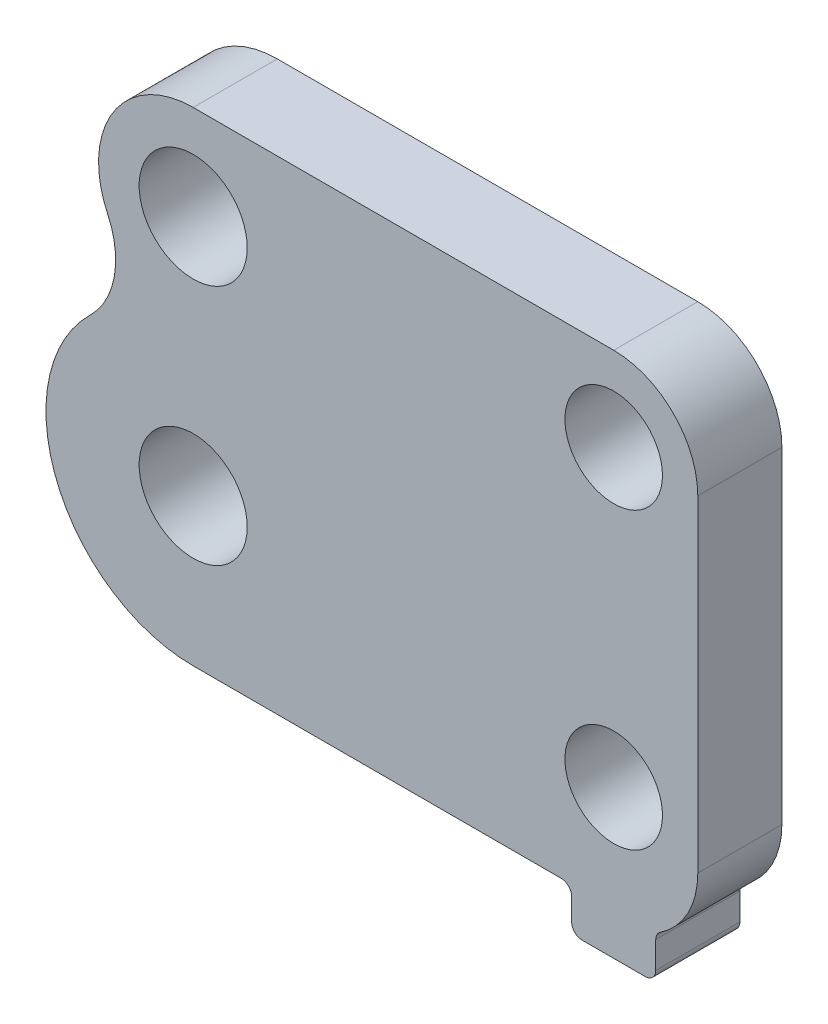
ISO-10303-21;
HEADER;
FILE_DESCRIPTION(('STEP AP214'),'2;1');
FILE_NAME('part.step','',(''),(''),'','','');
FILE_SCHEMA(('AUTOMOTIVE_DESIGN { 1 0 10303 214 1 1 1 1 }'));
ENDSEC;
DATA;
#1=APPLICATION_CONTEXT('core data for automotive mechanical design processes');
#2=APPLICATION_PROTOCOL_DEFINITION('international standard','automotive_design',2000,#1);
#3=PRODUCT_CONTEXT('',#1,'mechanical');
#4=PRODUCT('Part','Part','',(#3));
#5=PRODUCT_RELATED_PRODUCT_CATEGORY('part','',(#4));
#6=PRODUCT_DEFINITION_FORMATION('','',#4);
#7=PRODUCT_DEFINITION_CONTEXT('part definition',#1,'design');
#8=PRODUCT_DEFINITION('design','',#6,#7);
#9=PRODUCT_DEFINITION_SHAPE('','',#8);
#10=(LENGTH_UNIT() NAMED_UNIT(*) SI_UNIT(.MILLI.,.METRE.));
#11=(NAMED_UNIT(*) PLANE_ANGLE_UNIT() SI_UNIT($,.RADIAN.));
#12=(NAMED_UNIT(*) SI_UNIT($,.STERADIAN.) SOLID_ANGLE_UNIT());
#13=UNCERTAINTY_MEASURE_WITH_UNIT(LENGTH_MEASURE(1.E-05),#10,'distance_accuracy_value','');
#14=(GEOMETRIC_REPRESENTATION_CONTEXT(3) GLOBAL_UNCERTAINTY_ASSIGNED_CONTEXT((#13)) GLOBAL_UNIT_ASSIGNED_CONTEXT((#10,
#11,#12)) REPRESENTATION_CONTEXT('',''));
#15=CARTESIAN_POINT('',(0.,0.,0.));
#16=DIRECTION('',(0.,0.,1.));
#17=DIRECTION('',(1.,0.,0.));
#18=AXIS2_PLACEMENT_3D('',#15,#16,#17);
#19=CARTESIAN_POINT('',(0.,12.7,3.175));
#20=DIRECTION('',(0.,1.,0.));
#21=DIRECTION('',(0.,0.,1.));
#22=AXIS2_PLACEMENT_3D('',#19,#20,#21);
#23=PLANE('',#22);
#24=DIRECTION('',(1.,0.,0.));
#25=VECTOR('',#24,1.);
#26=CARTESIAN_POINT('',(0.,12.7,3.175));
#27=LINE('',#26,#25);
#28=CARTESIAN_POINT('',(0.,12.7,3.175));
#29=VERTEX_POINT('',#28);
#30=CARTESIAN_POINT('',(15.875,12.7,3.175));
#31=VERTEX_POINT('',#30);
#32=EDGE_CURVE('E150',#29,#31,#27,.T.);
#33=ORIENTED_EDGE('',*,*,#32,.T.);
#34=DIRECTION('',(0.,0.,-1.));
#35=VECTOR('',#34,1.);
#36=CARTESIAN_POINT('',(15.875,12.7,0.));
#37=LINE('',#36,#35);
#38=CARTESIAN_POINT('',(15.875,12.7,0.));
#39=VERTEX_POINT('',#38);
#40=EDGE_CURVE('E157',#31,#39,#37,.T.);
#41=ORIENTED_EDGE('',*,*,#40,.T.);
#42=DIRECTION('',(1.,0.,0.));
#43=VECTOR('',#42,1.);
#44=CARTESIAN_POINT('',(0.,12.7,0.));
#45=LINE('',#44,#43);
#46=CARTESIAN_POINT('',(0.,12.7,0.));
#47=VERTEX_POINT('',#46);
#48=EDGE_CURVE('E153',#47,#39,#45,.T.);
#49=ORIENTED_EDGE('',*,*,#48,.F.);
#50=DIRECTION('',(0.,0.,-1.));
#51=VECTOR('',#50,1.);
#52=CARTESIAN_POINT('',(0.,12.7,3.175));
#53=LINE('',#52,#51);
#54=EDGE_CURVE('E146',#29,#47,#53,.T.);
#55=ORIENTED_EDGE('',*,*,#54,.F.);
#56=EDGE_LOOP('',(#33,#41,#49,#55));
#57=FACE_BOUND('',#56,.T.);
#58=ADVANCED_FACE('F39',(#57),#23,.T.);
#59=CARTESIAN_POINT('',(0.,9.128125,3.175));
#60=DIRECTION('',(0.,0.,-1.));
#61=DIRECTION('',(-1.,0.,0.));
#62=AXIS2_PLACEMENT_3D('',#59,#60,#61);
#63=CYLINDRICAL_SURFACE('',#62,3.571875);
#64=CARTESIAN_POINT('',(0.,9.128125,0.));
#65=DIRECTION('',(0.,0.,1.));
#66=DIRECTION('',(1.,0.,0.));
#67=AXIS2_PLACEMENT_3D('',#64,#65,#66);
#68=CIRCLE('',#67,3.571875);
#69=CARTESIAN_POINT('',(-3.22968824866037,7.6025415601023,0.));
#70=VERTEX_POINT('',#69);
#71=EDGE_CURVE('E207',#47,#70,#68,.T.);
#72=ORIENTED_EDGE('',*,*,#71,.T.);
#73=DIRECTION('',(0.,0.,-1.));
#74=VECTOR('',#73,1.);
#75=CARTESIAN_POINT('',(-3.22968824866037,7.6025415601023,3.175));
#76=LINE('',#75,#74);
#77=CARTESIAN_POINT('',(-3.22968824866037,7.6025415601023,3.175));
#78=VERTEX_POINT('',#77);
#79=EDGE_CURVE('E158',#78,#70,#76,.T.);
#80=ORIENTED_EDGE('',*,*,#79,.F.);
#81=CARTESIAN_POINT('',(0.,9.128125,3.175));
#82=DIRECTION('',(0.,0.,1.));
#83=DIRECTION('',(1.,0.,0.));
#84=AXIS2_PLACEMENT_3D('',#81,#82,#83);
#85=CIRCLE('',#84,3.571875);
#86=EDGE_CURVE('E161',#29,#78,#85,.T.);
#87=ORIENTED_EDGE('',*,*,#86,.F.);
#88=ORIENTED_EDGE('',*,*,#54,.T.);
#89=EDGE_LOOP('',(#72,#80,#87,#88));
#90=FACE_BOUND('',#89,.T.);
#91=ADVANCED_FACE('F162',(#90),#63,.T.);
#92=CARTESIAN_POINT('',(-6.10052224746959,6.24646739130435,3.175));
#93=DIRECTION('',(0.,0.,-1.));
#94=DIRECTION('',(-1.,0.,0.));
#95=AXIS2_PLACEMENT_3D('',#92,#93,#94);
#96=CYLINDRICAL_SURFACE('',#95,3.175);
#97=CARTESIAN_POINT('',(-6.10052224746959,6.24646739130435,0.));
#98=DIRECTION('',(0.,0.,1.));
#99=DIRECTION('',(1.,0.,0.));
#100=AXIS2_PLACEMENT_3D('',#97,#98,#99);
#101=CIRCLE('',#100,3.175);
#102=CARTESIAN_POINT('',(-3.88215052111701,3.97502470355731,0.));
#103=VERTEX_POINT('',#102);
#104=EDGE_CURVE('E209',#103,#70,#101,.T.);
#105=ORIENTED_EDGE('',*,*,#104,.F.);
#106=DIRECTION('',(0.,0.,-1.));
#107=VECTOR('',#106,1.);
#108=CARTESIAN_POINT('',(-3.88215052111701,3.97502470355731,3.175));
#109=LINE('',#108,#107);
#110=CARTESIAN_POINT('',(-3.88215052111701,3.97502470355731,3.175));
#111=VERTEX_POINT('',#110);
#112=EDGE_CURVE('E238',#111,#103,#109,.T.);
#113=ORIENTED_EDGE('',*,*,#112,.F.);
#114=CARTESIAN_POINT('',(-6.10052224746959,6.24646739130435,3.175));
#115=DIRECTION('',(0.,0.,1.));
#116=DIRECTION('',(1.,0.,0.));
#117=AXIS2_PLACEMENT_3D('',#114,#115,#116);
#118=CIRCLE('',#117,3.175);
#119=EDGE_CURVE('E165',#111,#78,#118,.T.);
#120=ORIENTED_EDGE('',*,*,#119,.T.);
#121=ORIENTED_EDGE('',*,*,#79,.T.);
#122=EDGE_LOOP('',(#105,#113,#120,#121));
#123=FACE_BOUND('',#122,.T.);
#124=ADVANCED_FACE('F334',(#123),#96,.F.);
#125=CARTESIAN_POINT('',(0.,0.,3.175));
#126=DIRECTION('',(0.,0.,-1.));
#127=DIRECTION('',(-1.,0.,0.));
#128=AXIS2_PLACEMENT_3D('',#125,#126,#127);
#129=CYLINDRICAL_SURFACE('',#128,5.55625);
#130=CARTESIAN_POINT('',(0.,0.,0.));
#131=DIRECTION('',(0.,0.,1.));
#132=DIRECTION('',(1.,0.,0.));
#133=AXIS2_PLACEMENT_3D('',#130,#131,#132);
#134=CIRCLE('',#133,5.55625);
#135=CARTESIAN_POINT('',(0.,-5.55625,0.));
#136=VERTEX_POINT('',#135);
#137=EDGE_CURVE('E212',#103,#136,#134,.T.);
#138=ORIENTED_EDGE('',*,*,#137,.T.);
#139=DIRECTION('',(0.,0.,-1.));
#140=VECTOR('',#139,1.);
#141=CARTESIAN_POINT('',(0.,-5.55625,3.175));
#142=LINE('',#141,#140);
#143=CARTESIAN_POINT('',(0.,-5.55625,3.175));
#144=VERTEX_POINT('',#143);
#145=EDGE_CURVE('E205',#144,#136,#142,.T.);
#146=ORIENTED_EDGE('',*,*,#145,.F.);
#147=CARTESIAN_POINT('',(0.,0.,3.175));
#148=DIRECTION('',(0.,0.,1.));
#149=DIRECTION('',(1.,0.,0.));
#150=AXIS2_PLACEMENT_3D('',#147,#148,#149);
#151=CIRCLE('',#150,5.55625);
#152=EDGE_CURVE('E180',#111,#144,#151,.T.);
#153=ORIENTED_EDGE('',*,*,#152,.F.);
#154=ORIENTED_EDGE('',*,*,#112,.T.);
#155=EDGE_LOOP('',(#138,#146,#153,#154));
#156=FACE_BOUND('',#155,.T.);
#157=ADVANCED_FACE('F337',(#156),#129,.T.);
#158=CARTESIAN_POINT('',(0.,-5.55625,3.175));
#159=DIRECTION('',(0.,1.,0.));
#160=DIRECTION('',(-1.,0.,0.));
#161=AXIS2_PLACEMENT_3D('',#158,#159,#160);
#162=PLANE('',#161);
#163=DIRECTION('',(1.,0.,0.));
#164=VECTOR('',#163,1.);
#165=CARTESIAN_POINT('',(0.,-5.55625,0.));
#166=LINE('',#165,#164);
#167=CARTESIAN_POINT('',(13.890625,-5.55625,0.));
#168=VERTEX_POINT('',#167);
#169=EDGE_CURVE('E214',#136,#168,#166,.T.);
#170=ORIENTED_EDGE('',*,*,#169,.T.);
#171=DIRECTION('',(0.,0.,-1.));
#172=VECTOR('',#171,1.);
#173=CARTESIAN_POINT('',(13.890625,-5.55625,3.175));
#174=LINE('',#173,#172);
#175=CARTESIAN_POINT('',(13.890625,-5.55625,3.175));
#176=VERTEX_POINT('',#175);
#177=EDGE_CURVE('E280',#168,#176,#174,.F.);
#178=ORIENTED_EDGE('',*,*,#177,.T.);
#179=DIRECTION('',(1.,0.,0.));
#180=VECTOR('',#179,1.);
#181=CARTESIAN_POINT('',(0.,-5.55625,3.175));
#182=LINE('',#181,#180);
#183=EDGE_CURVE('E182',#144,#176,#182,.T.);
#184=ORIENTED_EDGE('',*,*,#183,.F.);
#185=ORIENTED_EDGE('',*,*,#145,.T.);
#186=EDGE_LOOP('',(#170,#178,#184,#185));
#187=FACE_BOUND('',#186,.T.);
#188=ADVANCED_FACE('F296',(#187),#162,.F.);
#189=CARTESIAN_POINT('',(14.2875,0.,3.175));
#190=DIRECTION('',(1.,0.,0.));
#191=DIRECTION('',(0.,1.,0.));
#192=AXIS2_PLACEMENT_3D('',#189,#190,#191);
#193=PLANE('',#192);
#194=DIRECTION('',(0.,-1.,0.));
#195=VECTOR('',#194,1.);
#196=CARTESIAN_POINT('',(14.2875,0.,0.));
#197=LINE('',#196,#195);
#198=CARTESIAN_POINT('',(14.2875,-5.953125,0.));
#199=VERTEX_POINT('',#198);
#200=CARTESIAN_POINT('',(14.2875,-6.784975,0.));
#201=VERTEX_POINT('',#200);
#202=EDGE_CURVE('E217',#199,#201,#197,.T.);
#203=ORIENTED_EDGE('',*,*,#202,.T.);
#204=DIRECTION('',(0.,0.,-1.));
#205=VECTOR('',#204,1.);
#206=CARTESIAN_POINT('',(14.2875,-6.784975,3.175));
#207=LINE('',#206,#205);
#208=CARTESIAN_POINT('',(14.2875,-6.784975,3.175));
#209=VERTEX_POINT('',#208);
#210=EDGE_CURVE('E54',#201,#209,#207,.F.);
#211=ORIENTED_EDGE('',*,*,#210,.T.);
#212=DIRECTION('',(0.,-1.,0.));
#213=VECTOR('',#212,1.);
#214=CARTESIAN_POINT('',(14.2875,0.,3.175));
#215=LINE('',#214,#213);
#216=CARTESIAN_POINT('',(14.2875,-5.953125,3.175));
#217=VERTEX_POINT('',#216);
#218=EDGE_CURVE('E184',#217,#209,#215,.T.);
#219=ORIENTED_EDGE('',*,*,#218,.F.);
#220=DIRECTION('',(0.,0.,-1.));
#221=VECTOR('',#220,1.);
#222=CARTESIAN_POINT('',(14.2875,-5.953125,0.));
#223=LINE('',#222,#221);
#224=EDGE_CURVE('E276',#217,#199,#223,.T.);
#225=ORIENTED_EDGE('',*,*,#224,.T.);
#226=EDGE_LOOP('',(#203,#211,#219,#225));
#227=FACE_BOUND('',#226,.T.);
#228=ADVANCED_FACE('F299',(#227),#193,.F.);
#229=CARTESIAN_POINT('',(0.,-7.18185,3.175));
#230=DIRECTION('',(0.,1.,0.));
#231=DIRECTION('',(-1.,0.,0.));
#232=AXIS2_PLACEMENT_3D('',#229,#230,#231);
#233=PLANE('',#232);
#234=DIRECTION('',(1.,0.,0.));
#235=VECTOR('',#234,1.);
#236=CARTESIAN_POINT('',(0.,-7.18185,0.));
#237=LINE('',#236,#235);
#238=CARTESIAN_POINT('',(14.684375,-7.18185,0.));
#239=VERTEX_POINT('',#238);
#240=CARTESIAN_POINT('',(17.065625,-7.18185,0.));
#241=VERTEX_POINT('',#240);
#242=EDGE_CURVE('E219',#239,#241,#237,.T.);
#243=ORIENTED_EDGE('',*,*,#242,.T.);
#244=DIRECTION('',(0.,0.,-1.));
#245=VECTOR('',#244,1.);
#246=CARTESIAN_POINT('',(17.065625,-7.18185,3.175));
#247=LINE('',#246,#245);
#248=CARTESIAN_POINT('',(17.065625,-7.18185,3.175));
#249=VERTEX_POINT('',#248);
#250=EDGE_CURVE('E270',#241,#249,#247,.F.);
#251=ORIENTED_EDGE('',*,*,#250,.T.);
#252=DIRECTION('',(1.,0.,0.));
#253=VECTOR('',#252,1.);
#254=CARTESIAN_POINT('',(0.,-7.18185,3.175));
#255=LINE('',#254,#253);
#256=CARTESIAN_POINT('',(14.684375,-7.18185,3.175));
#257=VERTEX_POINT('',#256);
#258=EDGE_CURVE('E186',#257,#249,#255,.T.);
#259=ORIENTED_EDGE('',*,*,#258,.F.);
#260=DIRECTION('',(0.,0.,-1.));
#261=VECTOR('',#260,1.);
#262=CARTESIAN_POINT('',(14.684375,-7.18185,3.175));
#263=LINE('',#262,#261);
#264=EDGE_CURVE('E267',#257,#239,#263,.T.);
#265=ORIENTED_EDGE('',*,*,#264,.T.);
#266=EDGE_LOOP('',(#243,#251,#259,#265));
#267=FACE_BOUND('',#266,.T.);
#268=ADVANCED_FACE('F307',(#267),#233,.F.);
#269=CARTESIAN_POINT('',(17.4625,0.,3.175));
#270=DIRECTION('',(-1.,0.,0.));
#271=DIRECTION('',(0.,0.,1.));
#272=AXIS2_PLACEMENT_3D('',#269,#270,#271);
#273=PLANE('',#272);
#274=DIRECTION('',(0.,1.,0.));
#275=VECTOR('',#274,1.);
#276=CARTESIAN_POINT('',(17.4625,0.,0.));
#277=LINE('',#276,#275);
#278=CARTESIAN_POINT('',(17.4625,-6.784975,0.));
#279=VERTEX_POINT('',#278);
#280=CARTESIAN_POINT('',(17.4625,-5.77655989373622,0.));
#281=VERTEX_POINT('',#280);
#282=EDGE_CURVE('E222',#279,#281,#277,.T.);
#283=ORIENTED_EDGE('',*,*,#282,.T.);
#284=DIRECTION('',(0.,0.,1.));
#285=VECTOR('',#284,1.);
#286=CARTESIAN_POINT('',(17.4625,-5.77655989373622,3.175));
#287=LINE('',#286,#285);
#288=CARTESIAN_POINT('',(17.4625,-5.77655989373622,3.175));
#289=VERTEX_POINT('',#288);
#290=EDGE_CURVE('E261',#281,#289,#287,.T.);
#291=ORIENTED_EDGE('',*,*,#290,.T.);
#292=DIRECTION('',(0.,1.,0.));
#293=VECTOR('',#292,1.);
#294=CARTESIAN_POINT('',(17.4625,0.,3.175));
#295=LINE('',#294,#293);
#296=CARTESIAN_POINT('',(17.4625,-6.784975,3.175));
#297=VERTEX_POINT('',#296);
#298=EDGE_CURVE('E188',#297,#289,#295,.T.);
#299=ORIENTED_EDGE('',*,*,#298,.F.);
#300=DIRECTION('',(0.,0.,-1.));
#301=VECTOR('',#300,1.);
#302=CARTESIAN_POINT('',(17.4625,-6.784975,3.175));
#303=LINE('',#302,#301);
#304=EDGE_CURVE('E258',#297,#279,#303,.T.);
#305=ORIENTED_EDGE('',*,*,#304,.T.);
#306=EDGE_LOOP('',(#283,#291,#299,#305));
#307=FACE_BOUND('',#306,.T.);
#308=ADVANCED_FACE('F315',(#307),#273,.F.);
#309=CARTESIAN_POINT('',(0.,0.,3.175));
#310=DIRECTION('',(0.,0.,-1.));
#311=DIRECTION('',(-1.,0.,0.));
#312=AXIS2_PLACEMENT_3D('',#309,#310,#311);
#313=CYLINDRICAL_SURFACE('',#312,2.0399375);
#314=CARTESIAN_POINT('',(0.,0.,3.175));
#315=DIRECTION('',(0.,0.,1.));
#316=DIRECTION('',(1.,0.,0.));
#317=AXIS2_PLACEMENT_3D('',#314,#315,#316);
#318=CIRCLE('',#317,2.0399375);
#319=CARTESIAN_POINT('',(2.0399375,0.,3.175));
#320=VERTEX_POINT('',#319);
#321=EDGE_CURVE('E199',#320,#320,#318,.T.);
#322=ORIENTED_EDGE('',*,*,#321,.T.);
#323=EDGE_LOOP('',(#322));
#324=FACE_BOUND('',#323,.T.);
#325=CARTESIAN_POINT('',(0.,0.,0.));
#326=DIRECTION('',(0.,0.,1.));
#327=DIRECTION('',(1.,0.,0.));
#328=AXIS2_PLACEMENT_3D('',#325,#326,#327);
#329=CIRCLE('',#328,2.0399375);
#330=CARTESIAN_POINT('',(2.0399375,0.,0.));
#331=VERTEX_POINT('',#330);
#332=EDGE_CURVE('E176',#331,#331,#329,.T.);
#333=ORIENTED_EDGE('',*,*,#332,.F.);
#334=EDGE_LOOP('',(#333));
#335=FACE_BOUND('',#334,.T.);
#336=ADVANCED_FACE('F420',(#324,#335),#313,.F.);
#337=CARTESIAN_POINT('',(15.875,9.525,3.175));
#338=DIRECTION('',(0.,0.,-1.));
#339=DIRECTION('',(-1.,0.,0.));
#340=AXIS2_PLACEMENT_3D('',#337,#338,#339);
#341=CYLINDRICAL_SURFACE('',#340,1.8415);
#342=CARTESIAN_POINT('',(15.875,9.525,3.175));
#343=DIRECTION('',(0.,0.,1.));
#344=DIRECTION('',(1.,0.,0.));
#345=AXIS2_PLACEMENT_3D('',#342,#343,#344);
#346=CIRCLE('',#345,1.8415);
#347=CARTESIAN_POINT('',(17.7165,9.525,3.175));
#348=VERTEX_POINT('',#347);
#349=EDGE_CURVE('E196',#348,#348,#346,.T.);
#350=ORIENTED_EDGE('',*,*,#349,.T.);
#351=EDGE_LOOP('',(#350));
#352=FACE_BOUND('',#351,.T.);
#353=CARTESIAN_POINT('',(15.875,9.525,0.));
#354=DIRECTION('',(0.,0.,1.));
#355=DIRECTION('',(1.,0.,0.));
#356=AXIS2_PLACEMENT_3D('',#353,#354,#355);
#357=CIRCLE('',#356,1.8415);
#358=CARTESIAN_POINT('',(17.7165,9.525,0.));
#359=VERTEX_POINT('',#358);
#360=EDGE_CURVE('E231',#359,#359,#357,.T.);
#361=ORIENTED_EDGE('',*,*,#360,.F.);
#362=EDGE_LOOP('',(#361));
#363=FACE_BOUND('',#362,.T.);
#364=ADVANCED_FACE('F482',(#352,#363),#341,.F.);
#365=CARTESIAN_POINT('',(15.875,-1.5875,3.175));
#366=DIRECTION('',(0.,0.,-1.));
#367=DIRECTION('',(-1.,0.,0.));
#368=AXIS2_PLACEMENT_3D('',#365,#366,#367);
#369=CYLINDRICAL_SURFACE('',#368,1.8415);
#370=CARTESIAN_POINT('',(15.875,-1.5875,3.175));
#371=DIRECTION('',(0.,0.,1.));
#372=DIRECTION('',(1.,0.,0.));
#373=AXIS2_PLACEMENT_3D('',#370,#371,#372);
#374=CIRCLE('',#373,1.8415);
#375=CARTESIAN_POINT('',(17.7165,-1.5875,3.175));
#376=VERTEX_POINT('',#375);
#377=EDGE_CURVE('E193',#376,#376,#374,.T.);
#378=ORIENTED_EDGE('',*,*,#377,.T.);
#379=EDGE_LOOP('',(#378));
#380=FACE_BOUND('',#379,.T.);
#381=CARTESIAN_POINT('',(15.875,-1.5875,0.));
#382=DIRECTION('',(0.,0.,1.));
#383=DIRECTION('',(1.,0.,0.));
#384=AXIS2_PLACEMENT_3D('',#381,#382,#383);
#385=CIRCLE('',#384,1.8415);
#386=CARTESIAN_POINT('',(17.7165,-1.5875,0.));
#387=VERTEX_POINT('',#386);
#388=EDGE_CURVE('E228',#387,#387,#385,.T.);
#389=ORIENTED_EDGE('',*,*,#388,.F.);
#390=EDGE_LOOP('',(#389));
#391=FACE_BOUND('',#390,.T.);
#392=ADVANCED_FACE('F457',(#380,#391),#369,.F.);
#393=CARTESIAN_POINT('',(19.05,0.,3.175));
#394=DIRECTION('',(-1.,0.,0.));
#395=DIRECTION('',(0.,0.,1.));
#396=AXIS2_PLACEMENT_3D('',#393,#394,#395);
#397=PLANE('',#396);
#398=DIRECTION('',(0.,1.,0.));
#399=VECTOR('',#398,1.);
#400=CARTESIAN_POINT('',(19.05,0.,0.));
#401=LINE('',#400,#399);
#402=CARTESIAN_POINT('',(19.05,-2.80661934298441,0.));
#403=VERTEX_POINT('',#402);
#404=CARTESIAN_POINT('',(19.05,9.525,0.));
#405=VERTEX_POINT('',#404);
#406=EDGE_CURVE('E225',#403,#405,#401,.T.);
#407=ORIENTED_EDGE('',*,*,#406,.T.);
#408=DIRECTION('',(0.,0.,-1.));
#409=VECTOR('',#408,1.);
#410=CARTESIAN_POINT('',(19.05,9.525,3.175));
#411=LINE('',#410,#409);
#412=CARTESIAN_POINT('',(19.05,9.525,3.175));
#413=VERTEX_POINT('',#412);
#414=EDGE_CURVE('E250',#405,#413,#411,.F.);
#415=ORIENTED_EDGE('',*,*,#414,.T.);
#416=DIRECTION('',(0.,1.,0.));
#417=VECTOR('',#416,1.);
#418=CARTESIAN_POINT('',(19.05,0.,3.175));
#419=LINE('',#418,#417);
#420=CARTESIAN_POINT('',(19.05,-2.80661934298441,3.175));
#421=VERTEX_POINT('',#420);
#422=EDGE_CURVE('E191',#421,#413,#419,.T.);
#423=ORIENTED_EDGE('',*,*,#422,.F.);
#424=DIRECTION('',(0.,0.,1.));
#425=VECTOR('',#424,1.);
#426=CARTESIAN_POINT('',(19.05,-2.80661934298441,3.175));
#427=LINE('',#426,#425);
#428=EDGE_CURVE('E247',#421,#403,#427,.F.);
#429=ORIENTED_EDGE('',*,*,#428,.T.);
#430=EDGE_LOOP('',(#407,#415,#423,#429));
#431=FACE_BOUND('',#430,.T.);
#432=ADVANCED_FACE('F328',(#431),#397,.F.);
#433=CARTESIAN_POINT('',(0.,9.128125,3.175));
#434=DIRECTION('',(0.,0.,-1.));
#435=DIRECTION('',(-1.,0.,0.));
#436=AXIS2_PLACEMENT_3D('',#433,#434,#435);
#437=CYLINDRICAL_SURFACE('',#436,2.0399375);
#438=CARTESIAN_POINT('',(0.,9.128125,3.175));
#439=DIRECTION('',(0.,0.,1.));
#440=DIRECTION('',(1.,0.,0.));
#441=AXIS2_PLACEMENT_3D('',#438,#439,#440);
#442=CIRCLE('',#441,2.0399375);
#443=CARTESIAN_POINT('',(2.0399375,9.128125,3.175));
#444=VERTEX_POINT('',#443);
#445=EDGE_CURVE('E202',#444,#444,#442,.T.);
#446=ORIENTED_EDGE('',*,*,#445,.T.);
#447=EDGE_LOOP('',(#446));
#448=FACE_BOUND('',#447,.T.);
#449=CARTESIAN_POINT('',(0.,9.128125,0.));
#450=DIRECTION('',(0.,0.,1.));
#451=DIRECTION('',(1.,0.,0.));
#452=AXIS2_PLACEMENT_3D('',#449,#450,#451);
#453=CIRCLE('',#452,2.0399375);
#454=CARTESIAN_POINT('',(2.0399375,9.128125,0.));
#455=VERTEX_POINT('',#454);
#456=EDGE_CURVE('E173',#455,#455,#453,.T.);
#457=ORIENTED_EDGE('',*,*,#456,.F.);
#458=EDGE_LOOP('',(#457));
#459=FACE_BOUND('',#458,.T.);
#460=ADVANCED_FACE('F408',(#448,#459),#437,.F.);
#461=CARTESIAN_POINT('',(0.,0.,3.175));
#462=DIRECTION('',(0.,0.,1.));
#463=DIRECTION('',(1.,0.,0.));
#464=AXIS2_PLACEMENT_3D('',#461,#462,#463);
#465=PLANE('',#464);
#466=ORIENTED_EDGE('',*,*,#258,.T.);
#467=CARTESIAN_POINT('',(17.065625,-6.784975,3.175));
#468=DIRECTION('',(0.,0.,1.));
#469=DIRECTION('',(1.,0.,0.));
#470=AXIS2_PLACEMENT_3D('',#467,#468,#469);
#471=CIRCLE('',#470,0.396875);
#472=EDGE_CURVE('E274',#249,#297,#471,.T.);
#473=ORIENTED_EDGE('',*,*,#472,.T.);
#474=ORIENTED_EDGE('',*,*,#298,.T.);
#475=CARTESIAN_POINT('',(17.859375,-5.77655989373622,3.175));
#476=DIRECTION('',(0.,0.,1.));
#477=DIRECTION('',(1.,0.,0.));
#478=AXIS2_PLACEMENT_3D('',#475,#476,#477);
#479=CIRCLE('',#478,0.396875);
#480=CARTESIAN_POINT('',(17.6388888888889,-5.44656649920824,3.175));
#481=VERTEX_POINT('',#480);
#482=EDGE_CURVE('E284',#289,#481,#479,.F.);
#483=ORIENTED_EDGE('',*,*,#482,.T.);
#484=CARTESIAN_POINT('',(15.875,-2.80661934298441,3.175));
#485=DIRECTION('',(0.,0.,1.));
#486=DIRECTION('',(1.,0.,0.));
#487=AXIS2_PLACEMENT_3D('',#484,#485,#486);
#488=CIRCLE('',#487,3.175);
#489=EDGE_CURVE('E252',#481,#421,#488,.T.);
#490=ORIENTED_EDGE('',*,*,#489,.T.);
#491=ORIENTED_EDGE('',*,*,#422,.T.);
#492=CARTESIAN_POINT('',(15.875,9.525,3.175));
#493=DIRECTION('',(0.,0.,1.));
#494=DIRECTION('',(1.,0.,0.));
#495=AXIS2_PLACEMENT_3D('',#492,#493,#494);
#496=CIRCLE('',#495,3.175);
#497=EDGE_CURVE('E172',#413,#31,#496,.T.);
#498=ORIENTED_EDGE('',*,*,#497,.T.);
#499=ORIENTED_EDGE('',*,*,#32,.F.);
#500=ORIENTED_EDGE('',*,*,#86,.T.);
#501=ORIENTED_EDGE('',*,*,#119,.F.);
#502=ORIENTED_EDGE('',*,*,#152,.T.);
#503=ORIENTED_EDGE('',*,*,#183,.T.);
#504=CARTESIAN_POINT('',(13.890625,-5.953125,3.175));
#505=DIRECTION('',(0.,0.,1.));
#506=DIRECTION('',(1.,0.,0.));
#507=AXIS2_PLACEMENT_3D('',#504,#505,#506);
#508=CIRCLE('',#507,0.396875);
#509=EDGE_CURVE('E11',#176,#217,#508,.F.);
#510=ORIENTED_EDGE('',*,*,#509,.T.);
#511=ORIENTED_EDGE('',*,*,#218,.T.);
#512=CARTESIAN_POINT('',(14.684375,-6.784975,3.175));
#513=DIRECTION('',(0.,0.,1.));
#514=DIRECTION('',(1.,0.,0.));
#515=AXIS2_PLACEMENT_3D('',#512,#513,#514);
#516=CIRCLE('',#515,0.396875);
#517=EDGE_CURVE('E272',#209,#257,#516,.T.);
#518=ORIENTED_EDGE('',*,*,#517,.T.);
#519=EDGE_LOOP('',(#466,#473,#474,#483,#490,#491,#498,#499,#500,#501,#502,#503,#510,#511,#518));
#520=FACE_BOUND('',#519,.T.);
#521=ORIENTED_EDGE('',*,*,#377,.F.);
#522=EDGE_LOOP('',(#521));
#523=FACE_BOUND('',#522,.T.);
#524=ORIENTED_EDGE('',*,*,#349,.F.);
#525=EDGE_LOOP('',(#524));
#526=FACE_BOUND('',#525,.T.);
#527=ORIENTED_EDGE('',*,*,#321,.F.);
#528=EDGE_LOOP('',(#527));
#529=FACE_BOUND('',#528,.T.);
#530=ORIENTED_EDGE('',*,*,#445,.F.);
#531=EDGE_LOOP('',(#530));
#532=FACE_BOUND('',#531,.T.);
#533=ADVANCED_FACE('F168',(#520,#523,#526,#529,#532),#465,.T.);
#534=CARTESIAN_POINT('',(0.,0.,0.));
#535=DIRECTION('',(0.,0.,1.));
#536=DIRECTION('',(1.,0.,0.));
#537=AXIS2_PLACEMENT_3D('',#534,#535,#536);
#538=PLANE('',#537);
#539=ORIENTED_EDGE('',*,*,#282,.F.);
#540=CARTESIAN_POINT('',(17.065625,-6.784975,0.));
#541=DIRECTION('',(0.,0.,1.));
#542=DIRECTION('',(1.,0.,0.));
#543=AXIS2_PLACEMENT_3D('',#540,#541,#542);
#544=CIRCLE('',#543,0.396875);
#545=EDGE_CURVE('E265',#279,#241,#544,.F.);
#546=ORIENTED_EDGE('',*,*,#545,.T.);
#547=ORIENTED_EDGE('',*,*,#242,.F.);
#548=CARTESIAN_POINT('',(14.684375,-6.784975,0.));
#549=DIRECTION('',(0.,0.,1.));
#550=DIRECTION('',(1.,0.,0.));
#551=AXIS2_PLACEMENT_3D('',#548,#549,#550);
#552=CIRCLE('',#551,0.396875);
#553=EDGE_CURVE('E263',#239,#201,#552,.F.);
#554=ORIENTED_EDGE('',*,*,#553,.T.);
#555=ORIENTED_EDGE('',*,*,#202,.F.);
#556=CARTESIAN_POINT('',(13.890625,-5.953125,0.));
#557=DIRECTION('',(0.,0.,1.));
#558=DIRECTION('',(1.,0.,0.));
#559=AXIS2_PLACEMENT_3D('',#556,#557,#558);
#560=CIRCLE('',#559,0.396875);
#561=EDGE_CURVE('E47',#199,#168,#560,.T.);
#562=ORIENTED_EDGE('',*,*,#561,.T.);
#563=ORIENTED_EDGE('',*,*,#169,.F.);
#564=ORIENTED_EDGE('',*,*,#137,.F.);
#565=ORIENTED_EDGE('',*,*,#104,.T.);
#566=ORIENTED_EDGE('',*,*,#71,.F.);
#567=ORIENTED_EDGE('',*,*,#48,.T.);
#568=CARTESIAN_POINT('',(15.875,9.525,0.));
#569=DIRECTION('',(0.,0.,1.));
#570=DIRECTION('',(1.,0.,0.));
#571=AXIS2_PLACEMENT_3D('',#568,#569,#570);
#572=CIRCLE('',#571,3.175);
#573=EDGE_CURVE('E245',#39,#405,#572,.F.);
#574=ORIENTED_EDGE('',*,*,#573,.T.);
#575=ORIENTED_EDGE('',*,*,#406,.F.);
#576=CARTESIAN_POINT('',(15.875,-2.80661934298441,0.));
#577=DIRECTION('',(0.,0.,1.));
#578=DIRECTION('',(1.,0.,0.));
#579=AXIS2_PLACEMENT_3D('',#576,#577,#578);
#580=CIRCLE('',#579,3.175);
#581=CARTESIAN_POINT('',(17.6388888888889,-5.44656649920824,0.));
#582=VERTEX_POINT('',#581);
#583=EDGE_CURVE('E242',#403,#582,#580,.F.);
#584=ORIENTED_EDGE('',*,*,#583,.T.);
#585=CARTESIAN_POINT('',(17.859375,-5.77655989373622,0.));
#586=DIRECTION('',(0.,0.,1.));
#587=DIRECTION('',(1.,0.,0.));
#588=AXIS2_PLACEMENT_3D('',#585,#586,#587);
#589=CIRCLE('',#588,0.396875);
#590=EDGE_CURVE('E282',#582,#281,#589,.T.);
#591=ORIENTED_EDGE('',*,*,#590,.T.);
#592=EDGE_LOOP('',(#539,#546,#547,#554,#555,#562,#563,#564,#565,#566,#567,#574,#575,#584,#591));
#593=FACE_BOUND('',#592,.T.);
#594=ORIENTED_EDGE('',*,*,#388,.T.);
#595=EDGE_LOOP('',(#594));
#596=FACE_BOUND('',#595,.T.);
#597=ORIENTED_EDGE('',*,*,#360,.T.);
#598=EDGE_LOOP('',(#597));
#599=FACE_BOUND('',#598,.T.);
#600=ORIENTED_EDGE('',*,*,#332,.T.);
#601=EDGE_LOOP('',(#600));
#602=FACE_BOUND('',#601,.T.);
#603=ORIENTED_EDGE('',*,*,#456,.T.);
#604=EDGE_LOOP('',(#603));
#605=FACE_BOUND('',#604,.T.);
#606=ADVANCED_FACE('F289',(#593,#596,#599,#602,#605),#538,.F.);
#607=CARTESIAN_POINT('',(15.875,9.525,3.175));
#608=DIRECTION('',(0.,0.,1.));
#609=DIRECTION('',(1.,0.,0.));
#610=AXIS2_PLACEMENT_3D('',#607,#608,#609);
#611=CYLINDRICAL_SURFACE('',#610,3.175);
#612=ORIENTED_EDGE('',*,*,#497,.F.);
#613=ORIENTED_EDGE('',*,*,#414,.F.);
#614=ORIENTED_EDGE('',*,*,#573,.F.);
#615=ORIENTED_EDGE('',*,*,#40,.F.);
#616=EDGE_LOOP('',(#612,#613,#614,#615));
#617=FACE_BOUND('',#616,.T.);
#618=ADVANCED_FACE('F331',(#617),#611,.T.);
#619=CARTESIAN_POINT('',(15.875,-2.80661934298441,3.175));
#620=DIRECTION('',(0.,0.,1.));
#621=DIRECTION('',(1.,0.,0.));
#622=AXIS2_PLACEMENT_3D('',#619,#620,#621);
#623=CYLINDRICAL_SURFACE('',#622,3.175);
#624=ORIENTED_EDGE('',*,*,#489,.F.);
#625=DIRECTION('',(0.,0.,1.));
#626=VECTOR('',#625,1.);
#627=CARTESIAN_POINT('',(17.6388888888889,-5.44656649920824,3.175));
#628=LINE('',#627,#626);
#629=EDGE_CURVE('E255',#481,#582,#628,.F.);
#630=ORIENTED_EDGE('',*,*,#629,.T.);
#631=ORIENTED_EDGE('',*,*,#583,.F.);
#632=ORIENTED_EDGE('',*,*,#428,.F.);
#633=EDGE_LOOP('',(#624,#630,#631,#632));
#634=FACE_BOUND('',#633,.T.);
#635=ADVANCED_FACE('F323',(#634),#623,.T.);
#636=CARTESIAN_POINT('',(17.859375,-5.77655989373622,3.175));
#637=DIRECTION('',(0.,0.,1.));
#638=DIRECTION('',(1.,0.,0.));
#639=AXIS2_PLACEMENT_3D('',#636,#637,#638);
#640=CYLINDRICAL_SURFACE('',#639,0.396875);
#641=ORIENTED_EDGE('',*,*,#482,.F.);
#642=ORIENTED_EDGE('',*,*,#290,.F.);
#643=ORIENTED_EDGE('',*,*,#590,.F.);
#644=ORIENTED_EDGE('',*,*,#629,.F.);
#645=EDGE_LOOP('',(#641,#642,#643,#644));
#646=FACE_BOUND('',#645,.T.);
#647=ADVANCED_FACE('F321',(#646),#640,.F.);
#648=CARTESIAN_POINT('',(17.065625,-6.784975,3.175));
#649=DIRECTION('',(0.,0.,-1.));
#650=DIRECTION('',(-1.,0.,0.));
#651=AXIS2_PLACEMENT_3D('',#648,#649,#650);
#652=CYLINDRICAL_SURFACE('',#651,0.396875);
#653=ORIENTED_EDGE('',*,*,#472,.F.);
#654=ORIENTED_EDGE('',*,*,#250,.F.);
#655=ORIENTED_EDGE('',*,*,#545,.F.);
#656=ORIENTED_EDGE('',*,*,#304,.F.);
#657=EDGE_LOOP('',(#653,#654,#655,#656));
#658=FACE_BOUND('',#657,.T.);
#659=ADVANCED_FACE('F312',(#658),#652,.T.);
#660=CARTESIAN_POINT('',(14.684375,-6.784975,3.175));
#661=DIRECTION('',(0.,0.,-1.));
#662=DIRECTION('',(-1.,0.,0.));
#663=AXIS2_PLACEMENT_3D('',#660,#661,#662);
#664=CYLINDRICAL_SURFACE('',#663,0.396875);
#665=ORIENTED_EDGE('',*,*,#517,.F.);
#666=ORIENTED_EDGE('',*,*,#210,.F.);
#667=ORIENTED_EDGE('',*,*,#553,.F.);
#668=ORIENTED_EDGE('',*,*,#264,.F.);
#669=EDGE_LOOP('',(#665,#666,#667,#668));
#670=FACE_BOUND('',#669,.T.);
#671=ADVANCED_FACE('F304',(#670),#664,.T.);
#672=CARTESIAN_POINT('',(13.890625,-5.953125,3.175));
#673=DIRECTION('',(0.,0.,1.));
#674=DIRECTION('',(1.,0.,0.));
#675=AXIS2_PLACEMENT_3D('',#672,#673,#674);
#676=CYLINDRICAL_SURFACE('',#675,0.396875);
#677=ORIENTED_EDGE('',*,*,#509,.F.);
#678=ORIENTED_EDGE('',*,*,#177,.F.);
#679=ORIENTED_EDGE('',*,*,#561,.F.);
#680=ORIENTED_EDGE('',*,*,#224,.F.);
#681=EDGE_LOOP('',(#677,#678,#679,#680));
#682=FACE_BOUND('',#681,.T.);
#683=ADVANCED_FACE('F41',(#682),#676,.F.);
#684=CLOSED_SHELL('',(#58,#91,#124,#157,#188,#228,#268,#308,#336,#364,#392,#432,#460,#533,#606,
#618,#635,#647,#659,#671,#683));
#685=MANIFOLD_SOLID_BREP('B2',#684);
#686=ADVANCED_BREP_SHAPE_REPRESENTATION('',(#18,#685),#14);
#687=SHAPE_DEFINITION_REPRESENTATION(#9,#686);
ENDSEC;
END-ISO-10303-21;
